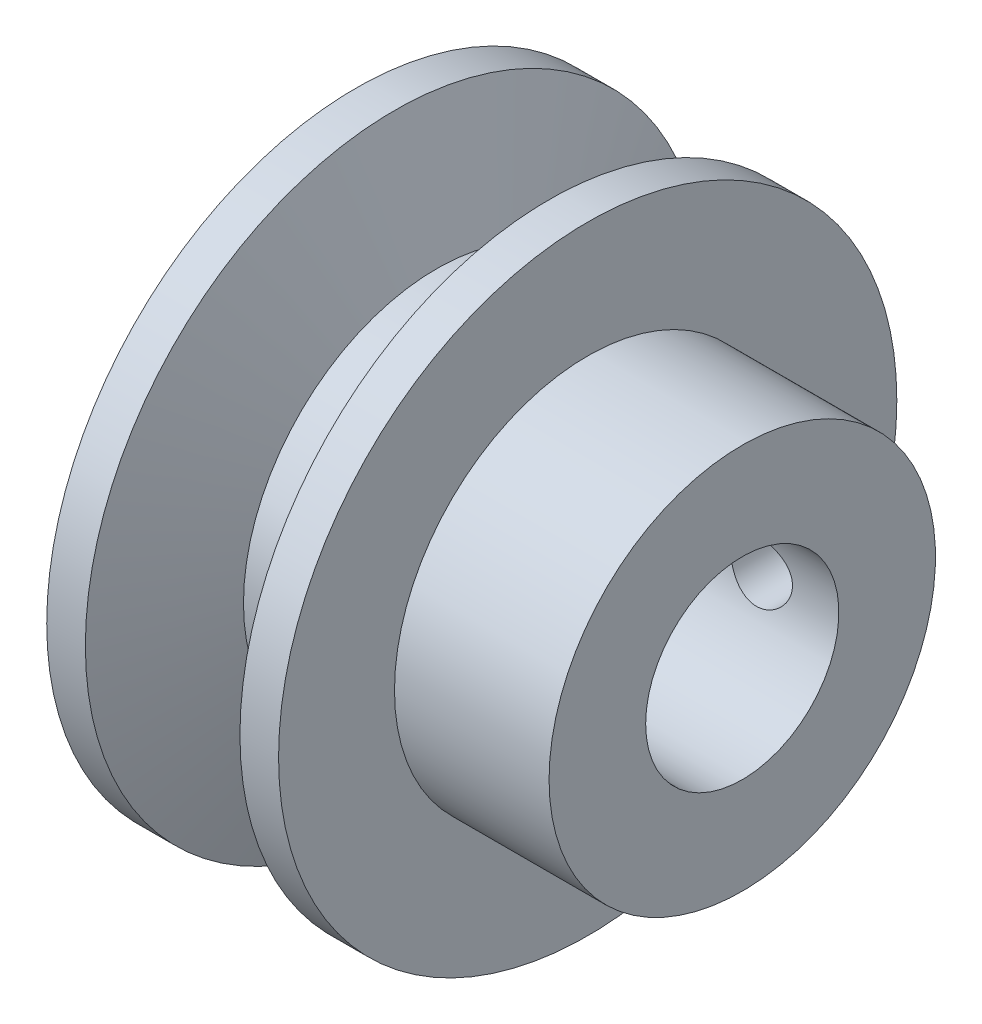
ISO-10303-21;
HEADER;
FILE_DESCRIPTION(('STEP AP214'),'2;1');
FILE_NAME('part.step','',(''),(''),'','','');
FILE_SCHEMA(('AUTOMOTIVE_DESIGN { 1 0 10303 214 1 1 1 1 }'));
ENDSEC;
DATA;
#1=APPLICATION_CONTEXT('core data for automotive mechanical design processes');
#2=APPLICATION_PROTOCOL_DEFINITION('international standard','automotive_design',2000,#1);
#3=PRODUCT_CONTEXT('',#1,'mechanical');
#4=PRODUCT('Part','Part','',(#3));
#5=PRODUCT_RELATED_PRODUCT_CATEGORY('part','',(#4));
#6=PRODUCT_DEFINITION_FORMATION('','',#4);
#7=PRODUCT_DEFINITION_CONTEXT('part definition',#1,'design');
#8=PRODUCT_DEFINITION('design','',#6,#7);
#9=PRODUCT_DEFINITION_SHAPE('','',#8);
#10=(LENGTH_UNIT() NAMED_UNIT(*) SI_UNIT(.MILLI.,.METRE.));
#11=(NAMED_UNIT(*) PLANE_ANGLE_UNIT() SI_UNIT($,.RADIAN.));
#12=(NAMED_UNIT(*) SI_UNIT($,.STERADIAN.) SOLID_ANGLE_UNIT());
#13=UNCERTAINTY_MEASURE_WITH_UNIT(LENGTH_MEASURE(1.E-05),#10,'distance_accuracy_value','');
#14=(GEOMETRIC_REPRESENTATION_CONTEXT(3) GLOBAL_UNCERTAINTY_ASSIGNED_CONTEXT((#13)) GLOBAL_UNIT_ASSIGNED_CONTEXT((#10,
#11,#12)) REPRESENTATION_CONTEXT('',''));
#15=CARTESIAN_POINT('',(0.,0.,0.));
#16=DIRECTION('',(0.,0.,1.));
#17=DIRECTION('',(1.,0.,0.));
#18=AXIS2_PLACEMENT_3D('',#15,#16,#17);
#19=CARTESIAN_POINT('',(50.,0.,0.));
#20=DIRECTION('',(1.,0.,0.));
#21=DIRECTION('',(0.,0.,-1.));
#22=AXIS2_PLACEMENT_3D('',#19,#20,#21);
#23=PLANE('',#22);
#24=CARTESIAN_POINT('',(50.,0.,0.));
#25=DIRECTION('',(-1.,0.,0.));
#26=DIRECTION('',(0.,0.,1.));
#27=AXIS2_PLACEMENT_3D('',#24,#25,#26);
#28=CIRCLE('',#27,12.5);
#29=CARTESIAN_POINT('',(50.,0.,12.5));
#30=VERTEX_POINT('',#29);
#31=EDGE_CURVE('E62',#30,#30,#28,.T.);
#32=ORIENTED_EDGE('',*,*,#31,.T.);
#33=EDGE_LOOP('',(#32));
#34=FACE_BOUND('',#33,.T.);
#35=CARTESIAN_POINT('',(50.,0.,0.));
#36=DIRECTION('',(-1.,0.,0.));
#37=DIRECTION('',(0.,0.,1.));
#38=AXIS2_PLACEMENT_3D('',#35,#36,#37);
#39=CIRCLE('',#38,25.);
#40=CARTESIAN_POINT('',(50.,0.,25.));
#41=VERTEX_POINT('',#40);
#42=EDGE_CURVE('E66',#41,#41,#39,.T.);
#43=ORIENTED_EDGE('',*,*,#42,.F.);
#44=EDGE_LOOP('',(#43));
#45=FACE_BOUND('',#44,.T.);
#46=ADVANCED_FACE('F55',(#34,#45),#23,.T.);
#47=CARTESIAN_POINT('',(40.,0.,-25.));
#48=DIRECTION('',(0.,0.,-1.));
#49=DIRECTION('',(-1.,0.,0.));
#50=AXIS2_PLACEMENT_3D('',#47,#48,#49);
#51=CYLINDRICAL_SURFACE('',#50,4.);
#52=CARTESIAN_POINT('',(36.,0.,-12.5));
#53=CARTESIAN_POINT('',(36.0000006091265,-0.218739515789949,-12.4999994635907));
#54=CARTESIAN_POINT('',(36.0180014881981,-0.437486592647651,-12.4942046039089));
#55=CARTESIAN_POINT('',(36.0893295488232,-0.868567253093706,-12.4716565543057));
#56=CARTESIAN_POINT('',(36.1426631795448,-1.08089965843427,-12.454901363839));
#57=CARTESIAN_POINT('',(36.2826623030294,-1.49287306447891,-12.4122595908852));
#58=CARTESIAN_POINT('',(36.3692747309265,-1.69253368346148,-12.3863875511298));
#59=CARTESIAN_POINT('',(36.5731420752182,-2.07449690712789,-12.3281725410718));
#60=CARTESIAN_POINT('',(36.690402264414,-2.25679651756236,-12.2958284575098));
#61=CARTESIAN_POINT('',(36.9562102837601,-2.60473689448744,-12.2269266983455));
#62=CARTESIAN_POINT('',(37.1055677473836,-2.76974023061599,-12.1902739433225));
#63=CARTESIAN_POINT('',(37.4296076663685,-3.07283559233071,-12.1174266425772));
#64=CARTESIAN_POINT('',(37.6042951191371,-3.21092229484498,-12.0812321888099));
#65=CARTESIAN_POINT('',(37.9796321362761,-3.45978487684573,-12.012370269974));
#66=CARTESIAN_POINT('',(38.1808407031768,-3.56975307774838,-11.9798196408788));
#67=CARTESIAN_POINT('',(38.6001058594249,-3.75402292836496,-11.9233664449728));
#68=CARTESIAN_POINT('',(38.8181577449692,-3.82833449433394,-11.8994614742253));
#69=CARTESIAN_POINT('',(39.2577065181837,-3.93682835778228,-11.8640030689908));
#70=CARTESIAN_POINT('',(39.4788802543856,-3.97219742115686,-11.8520853732299));
#71=CARTESIAN_POINT('',(39.9243189979557,-4.00551082647404,-11.8408707762137));
#72=CARTESIAN_POINT('',(40.1485831196096,-4.00346567735333,-11.8415703310132));
#73=CARTESIAN_POINT('',(40.5839139622491,-3.96293451839878,-11.8551904771854));
#74=CARTESIAN_POINT('',(40.795141133701,-3.92597105327877,-11.8676004346024));
#75=CARTESIAN_POINT('',(41.2082221111399,-3.81912647431514,-11.9024114349979));
#76=CARTESIAN_POINT('',(41.4100748739827,-3.74924170672462,-11.9248135869381));
#77=CARTESIAN_POINT('',(41.802244647037,-3.57749112898224,-11.9774663544073));
#78=CARTESIAN_POINT('',(41.9923405498713,-3.47515682759626,-12.0078307368189));
#79=CARTESIAN_POINT('',(42.3531551075743,-3.24173735834848,-12.0729361214443));
#80=CARTESIAN_POINT('',(42.5238685068609,-3.11064442067799,-12.1076783053403));
#81=CARTESIAN_POINT('',(42.8496616821636,-2.81601378851059,-12.1796593035711));
#82=CARTESIAN_POINT('',(43.0036019423465,-2.6512234062353,-12.216938020211));
#83=CARTESIAN_POINT('',(43.2819466955847,-2.29770358054263,-12.2883292028654));
#84=CARTESIAN_POINT('',(43.4063487828574,-2.10897218913167,-12.3224414108409));
#85=CARTESIAN_POINT('',(43.6229086082004,-1.710653951781,-12.3840447436164));
#86=CARTESIAN_POINT('',(43.714782752091,-1.50090319860161,-12.411477013699));
#87=CARTESIAN_POINT('',(43.8615989916568,-1.06783962590281,-12.4562040275044));
#88=CARTESIAN_POINT('',(43.9165528695418,-0.844531157828867,-12.4735020051158));
#89=CARTESIAN_POINT('',(43.986000166663,-0.400354473973302,-12.4954856059785));
#90=CARTESIAN_POINT('',(44.0020351840278,-0.179750715042688,-12.5006515044539));
#91=CARTESIAN_POINT('',(43.9975519544467,0.261025673970263,-12.4992163829611));
#92=CARTESIAN_POINT('',(43.9770393367253,0.481198365218597,-12.4926171751051));
#93=CARTESIAN_POINT('',(43.9012747172971,0.908837545509528,-12.4687095079374));
#94=CARTESIAN_POINT('',(43.8469502247852,1.11648590619506,-12.4516871662316));
#95=CARTESIAN_POINT('',(43.7062455015094,1.51965413650146,-12.4089396498837));
#96=CARTESIAN_POINT('',(43.6198612584946,1.71517248448531,-12.3832133859887));
#97=CARTESIAN_POINT('',(43.4150724570546,2.09399230967611,-12.3248882754976));
#98=CARTESIAN_POINT('',(43.2959187201442,2.27686405125241,-12.2921331567523));
#99=CARTESIAN_POINT('',(43.0298653175359,2.62052875751655,-12.223485206012));
#100=CARTESIAN_POINT('',(42.8829577838542,2.78131543888496,-12.187591485802));
#101=CARTESIAN_POINT('',(42.5583146009726,3.08320803721588,-12.1148241820809));
#102=CARTESIAN_POINT('',(42.3795493307788,3.2232144868905,-12.0779721041684));
#103=CARTESIAN_POINT('',(42.0002633138545,3.47135354981423,-12.0090110777536));
#104=CARTESIAN_POINT('',(41.7997427463649,3.57948642564104,-11.9769020901785));
#105=CARTESIAN_POINT('',(41.3828910533598,3.76018950753078,-11.9214065721644));
#106=CARTESIAN_POINT('',(41.1666146625258,3.83287665768614,-11.8979914205013));
#107=CARTESIAN_POINT('',(40.7239819754742,3.94051670615503,-11.8627820424832));
#108=CARTESIAN_POINT('',(40.49762979716,3.97548487516417,-11.8509831134183));
#109=CARTESIAN_POINT('',(40.05281007709,4.00556338278915,-11.8408481974692));
#110=CARTESIAN_POINT('',(39.8344774716775,4.00248471115015,-11.8419004772846));
#111=CARTESIAN_POINT('',(39.4016074864132,3.96095887873425,-11.8558539773436));
#112=CARTESIAN_POINT('',(39.1870699135974,3.92251352152802,-11.8687545933658));
#113=CARTESIAN_POINT('',(38.7712914365578,3.81258331041153,-11.9045135786104));
#114=CARTESIAN_POINT('',(38.5698920027678,3.74164069856766,-11.9272081809191));
#115=CARTESIAN_POINT('',(38.181695598998,3.56916068710955,-11.979949389859));
#116=CARTESIAN_POINT('',(37.9949017105932,3.46761685286564,-12.009997542498));
#117=CARTESIAN_POINT('',(37.632975925464,3.2319816676858,-12.0755873592094));
#118=CARTESIAN_POINT('',(37.4586293431649,3.09673271078946,-12.111302976317));
#119=CARTESIAN_POINT('',(37.1345206354476,2.79953499482212,-12.1834295211838));
#120=CARTESIAN_POINT('',(36.9847652370034,2.63757895417058,-12.2198406361674));
#121=CARTESIAN_POINT('',(36.7088542851904,2.28478052574589,-12.2907777050029));
#122=CARTESIAN_POINT('',(36.5837026202892,2.09312837940196,-12.3251937970096));
#123=CARTESIAN_POINT('',(36.3675495297569,1.69040882481735,-12.3868446924465));
#124=CARTESIAN_POINT('',(36.276536301698,1.4793481580204,-12.4140819767823));
#125=CARTESIAN_POINT('',(36.1368805504239,1.05915857911211,-12.4567085266016));
#126=CARTESIAN_POINT('',(36.0857038735422,0.850941916218327,-12.4727975325363));
#127=CARTESIAN_POINT('',(36.01726714274,0.428485002690299,-12.4944423385348));
#128=CARTESIAN_POINT('',(35.9999994033863,0.214246128153487,-12.5000005253903));
#129=CARTESIAN_POINT('',(36.,0.,-12.5));
#130=B_SPLINE_CURVE_WITH_KNOTS('',3,(#52,#53,#54,#55,#56,#57,#58,#59,#60,#61,#62,#63,#64,#65,
#66,#67,#68,#69,#70,#71,#72,#73,#74,#75,#76,#77,#78,#79,#80,#81,#82,#83,#84,#85,#86,#87,#88,#89,
#90,#91,#92,#93,#94,#95,#96,#97,#98,#99,#100,#101,#102,#103,#104,#105,#106,#107,#108,#109,#110,
#111,#112,#113,#114,#115,#116,#117,#118,#119,#120,#121,#122,#123,#124,#125,#126,#127,#128,#129),
.UNSPECIFIED.,.T.,.F.,(4,2,2,2,2,2,2,2,2,2,2,2,2,2,2,2,2,2,2,2,2,2,2,2,2,2,2,2,2,2,2,2,2,2,2,2,
2,2,4),(0.,0.655430724666217,1.31098111587091,1.96549050527927,2.62011257411757,
3.29374295378917,3.96750641671064,4.65887072066566,5.35004264179886,6.01951224998766,
6.68879381985558,7.33017723381302,7.97163184802041,8.62280489842004,9.27415409537618,
9.95668212026653,10.6392657156648,11.3276617834058,12.0158380617097,12.6762752648346,
13.3366107533684,13.9795854097457,14.6226405610093,15.281833876428,15.9412143491714,
16.6280748263774,17.3149296449995,17.9995027669286,18.6837986322708,19.3356533743721,
19.9874748761256,20.6287955720838,21.2702512150686,21.937843916949,22.6056189371905,
23.2966571383324,23.9874562112942,24.6295685076846,25.2715352530413),.UNSPECIFIED.);
#131=CARTESIAN_POINT('',(36.,0.,-12.5));
#132=VERTEX_POINT('',#131);
#133=EDGE_CURVE('E96',#132,#132,#130,.T.);
#134=ORIENTED_EDGE('',*,*,#133,.T.);
#135=EDGE_LOOP('',(#134));
#136=FACE_BOUND('',#135,.T.);
#137=CARTESIAN_POINT('',(44.,0.,-25.));
#138=CARTESIAN_POINT('',(43.9999993699836,0.11151725459432,-24.9999997550203));
#139=CARTESIAN_POINT('',(43.9953322293648,0.223050814303785,-24.9992518303276));
#140=CARTESIAN_POINT('',(43.9766955731456,0.445359780639853,-24.9962802429163));
#141=CARTESIAN_POINT('',(43.9627217141043,0.55613480886156,-24.9940558911516));
#142=CARTESIAN_POINT('',(43.9255398943716,0.776279842626285,-24.9881876680656));
#143=CARTESIAN_POINT('',(43.9023170691677,0.885647292455339,-24.9845415118837));
#144=CARTESIAN_POINT('',(43.8468231712934,1.10202107791946,-24.975934611509));
#145=CARTESIAN_POINT('',(43.8145486683073,1.20902650180103,-24.9709733689767));
#146=CARTESIAN_POINT('',(43.7045804675347,1.52501032252093,-24.9543298929867));
#147=CARTESIAN_POINT('',(43.6136550469055,1.72946770862317,-24.9408733366944));
#148=CARTESIAN_POINT('',(43.399286307076,2.12003271494625,-24.910719881338));
#149=CARTESIAN_POINT('',(43.275855353493,2.30614727614598,-24.894024215117));
#150=CARTESIAN_POINT('',(42.9987546875774,2.65664140331742,-24.8590734844916));
#151=CARTESIAN_POINT('',(42.8448505932301,2.82083485309682,-24.8408069964396));
#152=CARTESIAN_POINT('',(42.5116796706622,3.12118362008291,-24.8048616618847));
#153=CARTESIAN_POINT('',(42.3324100024415,3.25733579351315,-24.7871828814572));
#154=CARTESIAN_POINT('',(41.9523515598787,3.49846318488527,-24.7543066117487));
#155=CARTESIAN_POINT('',(41.7514474191694,3.60325873524733,-24.7391236382185));
#156=CARTESIAN_POINT('',(41.3346067515467,3.77754539820772,-24.713113221201));
#157=CARTESIAN_POINT('',(41.1186712901907,3.84703901043855,-24.7022854693439));
#158=CARTESIAN_POINT('',(40.6798394434142,3.94817508813217,-24.686322902375));
#159=CARTESIAN_POINT('',(40.4570177600207,3.98013403574232,-24.6811405144121));
#160=CARTESIAN_POINT('',(40.0091183946412,4.00627423619823,-24.6769113419527));
#161=CARTESIAN_POINT('',(39.7840408569872,4.00045789073542,-24.6778641673893));
#162=CARTESIAN_POINT('',(39.3402708751486,3.95147108570599,-24.6857542780142));
#163=CARTESIAN_POINT('',(39.1215381305491,3.90865522229075,-24.6926347518736));
#164=CARTESIAN_POINT('',(38.6943995336652,3.78743935312285,-24.7115161704094));
#165=CARTESIAN_POINT('',(38.4859940962846,3.70903791898919,-24.7235173206253));
#166=CARTESIAN_POINT('',(38.084353858252,3.51851269628484,-24.751350156679));
#167=CARTESIAN_POINT('',(37.891191226106,3.40623936388775,-24.767198767097));
#168=CARTESIAN_POINT('',(37.5263251205786,3.15126348149077,-24.8009276499781));
#169=CARTESIAN_POINT('',(37.3546215755056,3.00856103315438,-24.8188079156534));
#170=CARTESIAN_POINT('',(37.0355213715094,2.69490376517042,-24.854831893305));
#171=CARTESIAN_POINT('',(36.8884190408464,2.52364992782859,-24.8729763102821));
#172=CARTESIAN_POINT('',(36.624889488915,2.15853265191804,-24.9073126217894));
#173=CARTESIAN_POINT('',(36.5084760458209,1.96465911409899,-24.9235036375517));
#174=CARTESIAN_POINT('',(36.3594694313742,1.6611251714002,-24.9449607805563));
#175=CARTESIAN_POINT('',(36.3140267189083,1.55768235357734,-24.951648512437));
#176=CARTESIAN_POINT('',(36.232034352782,1.3472779681061,-24.9638922094));
#177=CARTESIAN_POINT('',(36.195481271848,1.24031777464545,-24.9694486105161));
#178=CARTESIAN_POINT('',(36.1316014215699,1.0238244505048,-24.9792616836015));
#179=CARTESIAN_POINT('',(36.1042592570173,0.914295943655119,-24.9835205231762));
#180=CARTESIAN_POINT('',(36.0589315734,0.693317830764865,-24.9906285737655));
#181=CARTESIAN_POINT('',(36.0409415487838,0.581869176574785,-24.9934784635328));
#182=CARTESIAN_POINT('',(36.0184721433002,0.391918401250993,-24.9970495475788));
#183=CARTESIAN_POINT('',(36.0115478287319,0.313703750696993,-24.9981545305223));
#184=CARTESIAN_POINT('',(36.0023115336206,0.156995426820081,-24.9996298432316));
#185=CARTESIAN_POINT('',(35.9999995565046,0.0785017532898934,-25.0000001724516));
#186=CARTESIAN_POINT('',(36.0000006300164,-0.111517254594319,-24.9999997550203));
#187=CARTESIAN_POINT('',(36.0046677706352,-0.223050814303784,-24.9992518303276));
#188=CARTESIAN_POINT('',(36.0233044268544,-0.445359780639852,-24.9962802429163));
#189=CARTESIAN_POINT('',(36.0372782858957,-0.556134808861559,-24.9940558911516));
#190=CARTESIAN_POINT('',(36.0744601056284,-0.776279842626285,-24.9881876680656));
#191=CARTESIAN_POINT('',(36.0976829308323,-0.885647292455338,-24.9845415118837));
#192=CARTESIAN_POINT('',(36.1531768287066,-1.10202107791946,-24.975934611509));
#193=CARTESIAN_POINT('',(36.1854513316927,-1.20902650180103,-24.9709733689767));
#194=CARTESIAN_POINT('',(36.2954195324653,-1.52501032252093,-24.9543298929867));
#195=CARTESIAN_POINT('',(36.3863449530945,-1.72946770862317,-24.9408733366944));
#196=CARTESIAN_POINT('',(36.600713692924,-2.12003271494625,-24.910719881338));
#197=CARTESIAN_POINT('',(36.724144646507,-2.30614727614598,-24.894024215117));
#198=CARTESIAN_POINT('',(37.0012453124226,-2.65664140331742,-24.8590734844916));
#199=CARTESIAN_POINT('',(37.1551494067699,-2.82083485309682,-24.8408069964396));
#200=CARTESIAN_POINT('',(37.4883203293378,-3.12118362008291,-24.8048616618847));
#201=CARTESIAN_POINT('',(37.6675899975585,-3.25733579351315,-24.7871828814572));
#202=CARTESIAN_POINT('',(38.0476484401214,-3.49846318488527,-24.7543066117487));
#203=CARTESIAN_POINT('',(38.2485525808306,-3.60325873524734,-24.7391236382185));
#204=CARTESIAN_POINT('',(38.6653932484533,-3.77754539820772,-24.713113221201));
#205=CARTESIAN_POINT('',(38.8813287098093,-3.84703901043855,-24.7022854693439));
#206=CARTESIAN_POINT('',(39.3201605565858,-3.94817508813217,-24.686322902375));
#207=CARTESIAN_POINT('',(39.5429822399793,-3.98013403574232,-24.6811405144121));
#208=CARTESIAN_POINT('',(39.9908816053588,-4.00627423619823,-24.6769113419527));
#209=CARTESIAN_POINT('',(40.2159591430128,-4.00045789073542,-24.6778641673893));
#210=CARTESIAN_POINT('',(40.6597291248514,-3.95147108570599,-24.6857542780142));
#211=CARTESIAN_POINT('',(40.8784618694509,-3.90865522229074,-24.6926347518736));
#212=CARTESIAN_POINT('',(41.3056004663348,-3.78743935312285,-24.7115161704094));
#213=CARTESIAN_POINT('',(41.5140059037154,-3.70903791898919,-24.7235173206253));
#214=CARTESIAN_POINT('',(41.915646141748,-3.51851269628484,-24.751350156679));
#215=CARTESIAN_POINT('',(42.108808773894,-3.40623936388775,-24.767198767097));
#216=CARTESIAN_POINT('',(42.4736748794214,-3.15126348149077,-24.8009276499781));
#217=CARTESIAN_POINT('',(42.6453784244944,-3.00856103315438,-24.8188079156534));
#218=CARTESIAN_POINT('',(42.9644786284906,-2.69490376517042,-24.854831893305));
#219=CARTESIAN_POINT('',(43.1115809591536,-2.52364992782859,-24.8729763102821));
#220=CARTESIAN_POINT('',(43.375110511085,-2.15853265191804,-24.9073126217894));
#221=CARTESIAN_POINT('',(43.4915239541791,-1.96465911409899,-24.9235036375517));
#222=CARTESIAN_POINT('',(43.6405305686258,-1.6611251714002,-24.9449607805563));
#223=CARTESIAN_POINT('',(43.6859732810917,-1.55768235357734,-24.951648512437));
#224=CARTESIAN_POINT('',(43.767965647218,-1.3472779681061,-24.9638922094));
#225=CARTESIAN_POINT('',(43.804518728152,-1.24031777464544,-24.9694486105161));
#226=CARTESIAN_POINT('',(43.8683985784301,-1.0238244505048,-24.9792616836015));
#227=CARTESIAN_POINT('',(43.8957407429827,-0.914295943655118,-24.9835205231762));
#228=CARTESIAN_POINT('',(43.9410684266,-0.693317830764865,-24.9906285737655));
#229=CARTESIAN_POINT('',(43.9590584512162,-0.581869176574785,-24.9934784635328));
#230=CARTESIAN_POINT('',(43.9815278566998,-0.391918401250994,-24.9970495475788));
#231=CARTESIAN_POINT('',(43.9884521712681,-0.313703750696994,-24.9981545305223));
#232=CARTESIAN_POINT('',(43.9976884663794,-0.156995426820081,-24.9996298432316));
#233=CARTESIAN_POINT('',(44.0000004434954,-0.0785017532898938,-25.0000001724516));
#234=CARTESIAN_POINT('',(44.,0.,-25.));
#235=B_SPLINE_CURVE_WITH_KNOTS('',3,(#137,#138,#139,#140,#141,#142,#143,#144,#145,#146,#147,
#148,#149,#150,#151,#152,#153,#154,#155,#156,#157,#158,#159,#160,#161,#162,#163,#164,#165,#166,
#167,#168,#169,#170,#171,#172,#173,#174,#175,#176,#177,#178,#179,#180,#181,#182,#183,#184,#185,
#186,#187,#188,#189,#190,#191,#192,#193,#194,#195,#196,#197,#198,#199,#200,#201,#202,#203,#204,
#205,#206,#207,#208,#209,#210,#211,#212,#213,#214,#215,#216,#217,#218,#219,#220,#221,#222,#223,
#224,#225,#226,#227,#228,#229,#230,#231,#232,#233,#234),.UNSPECIFIED.,.T.,.F.,(4,2,2,2,2,2,2,2,
2,2,2,2,2,2,2,2,2,2,2,2,2,2,2,2,2,2,2,2,2,2,2,2,2,2,2,2,2,2,2,2,2,2,2,2,2,2,2,2,4),(0.,
0.334479260084594,0.66911473096908,1.0042901969669,1.33959285650475,2.00866082488834,
2.6774746360124,3.35164774962302,4.02589640534446,4.70393748847212,5.38193055469347,
6.05416496349351,6.72635663314627,7.39217670746758,8.05802350972541,8.72685413699699,
9.3956825297447,10.0720149279805,10.7486504592732,11.0878602493619,11.4269390537847,
11.765448273888,12.103794259962,12.3392483064394,12.5747025278625,12.909181787947,
13.2438172588315,13.5789927248294,13.9142953843672,14.5833633527508,15.2521771638749,
15.9263502774855,16.6005989332069,17.2786400163346,17.9566330825559,18.628867491356,
19.3010591610087,19.96687923533,20.6327260375879,21.3015566648594,21.9703850576072,
22.6467174558429,23.3233529871357,23.6625627772244,24.0016415816472,24.3401508017504,
24.6784967878244,24.9139508343018,25.1494050557249),.UNSPECIFIED.);
#236=CARTESIAN_POINT('',(44.,0.,-25.));
#237=VERTEX_POINT('',#236);
#238=EDGE_CURVE('E104',#237,#237,#235,.T.);
#239=ORIENTED_EDGE('',*,*,#238,.F.);
#240=EDGE_LOOP('',(#239));
#241=FACE_BOUND('',#240,.T.);
#242=ADVANCED_FACE('F113',(#136,#241),#51,.F.);
#243=CARTESIAN_POINT('',(5.,0.,0.));
#244=DIRECTION('',(-1.,0.,0.));
#245=DIRECTION('',(0.,0.,1.));
#246=AXIS2_PLACEMENT_3D('',#243,#244,#245);
#247=CONICAL_SURFACE('',#246,12.5,0.982793723247329);
#248=CARTESIAN_POINT('',(0.,0.,0.));
#249=DIRECTION('',(-1.,0.,0.));
#250=DIRECTION('',(0.,0.,1.));
#251=AXIS2_PLACEMENT_3D('',#248,#249,#250);
#252=CIRCLE('',#251,20.);
#253=CARTESIAN_POINT('',(0.,0.,20.));
#254=VERTEX_POINT('',#253);
#255=EDGE_CURVE('E93',#254,#254,#252,.T.);
#256=ORIENTED_EDGE('',*,*,#255,.T.);
#257=EDGE_LOOP('',(#256));
#258=FACE_BOUND('',#257,.T.);
#259=CARTESIAN_POINT('',(5.,0.,0.));
#260=DIRECTION('',(-1.,0.,0.));
#261=DIRECTION('',(0.,0.,1.));
#262=AXIS2_PLACEMENT_3D('',#259,#260,#261);
#263=CIRCLE('',#262,12.5);
#264=CARTESIAN_POINT('',(5.,0.,12.5));
#265=VERTEX_POINT('',#264);
#266=EDGE_CURVE('E11',#265,#265,#263,.T.);
#267=ORIENTED_EDGE('',*,*,#266,.F.);
#268=EDGE_LOOP('',(#267));
#269=FACE_BOUND('',#268,.T.);
#270=ADVANCED_FACE('F57',(#258,#269),#247,.F.);
#271=CARTESIAN_POINT('',(-23.2214843556114,0.,0.));
#272=DIRECTION('',(-1.,0.,0.));
#273=DIRECTION('',(0.,0.,1.));
#274=AXIS2_PLACEMENT_3D('',#271,#272,#273);
#275=CYLINDRICAL_SURFACE('',#274,12.5);
#276=ORIENTED_EDGE('',*,*,#133,.F.);
#277=EDGE_LOOP('',(#276));
#278=FACE_BOUND('',#277,.T.);
#279=ORIENTED_EDGE('',*,*,#31,.F.);
#280=EDGE_LOOP('',(#279));
#281=FACE_BOUND('',#280,.T.);
#282=ORIENTED_EDGE('',*,*,#266,.T.);
#283=EDGE_LOOP('',(#282));
#284=FACE_BOUND('',#283,.T.);
#285=ADVANCED_FACE('F149',(#278,#281,#284),#275,.F.);
#286=CARTESIAN_POINT('',(-23.2214843556114,0.,0.));
#287=DIRECTION('',(-1.,0.,0.));
#288=DIRECTION('',(0.,0.,1.));
#289=AXIS2_PLACEMENT_3D('',#286,#287,#288);
#290=CYLINDRICAL_SURFACE('',#289,25.);
#291=ORIENTED_EDGE('',*,*,#42,.T.);
#292=EDGE_LOOP('',(#291));
#293=FACE_BOUND('',#292,.T.);
#294=CARTESIAN_POINT('',(30.,0.,0.));
#295=DIRECTION('',(-1.,0.,0.));
#296=DIRECTION('',(0.,0.,1.));
#297=AXIS2_PLACEMENT_3D('',#294,#295,#296);
#298=CIRCLE('',#297,25.);
#299=CARTESIAN_POINT('',(30.,0.,25.));
#300=VERTEX_POINT('',#299);
#301=EDGE_CURVE('E70',#300,#300,#298,.T.);
#302=ORIENTED_EDGE('',*,*,#301,.F.);
#303=EDGE_LOOP('',(#302));
#304=FACE_BOUND('',#303,.T.);
#305=ORIENTED_EDGE('',*,*,#238,.T.);
#306=EDGE_LOOP('',(#305));
#307=FACE_BOUND('',#306,.T.);
#308=ADVANCED_FACE('F145',(#293,#304,#307),#290,.T.);
#309=CARTESIAN_POINT('',(30.,0.,0.));
#310=DIRECTION('',(1.,0.,0.));
#311=DIRECTION('',(0.,0.,-1.));
#312=AXIS2_PLACEMENT_3D('',#309,#310,#311);
#313=PLANE('',#312);
#314=ORIENTED_EDGE('',*,*,#301,.T.);
#315=EDGE_LOOP('',(#314));
#316=FACE_BOUND('',#315,.T.);
#317=CARTESIAN_POINT('',(30.,0.,0.));
#318=DIRECTION('',(-1.,0.,0.));
#319=DIRECTION('',(0.,0.,1.));
#320=AXIS2_PLACEMENT_3D('',#317,#318,#319);
#321=CIRCLE('',#320,40.);
#322=CARTESIAN_POINT('',(30.,0.,40.));
#323=VERTEX_POINT('',#322);
#324=EDGE_CURVE('E75',#323,#323,#321,.T.);
#325=ORIENTED_EDGE('',*,*,#324,.F.);
#326=EDGE_LOOP('',(#325));
#327=FACE_BOUND('',#326,.T.);
#328=ADVANCED_FACE('F141',(#316,#327),#313,.T.);
#329=CARTESIAN_POINT('',(-23.2214843556114,0.,0.));
#330=DIRECTION('',(-1.,0.,0.));
#331=DIRECTION('',(0.,0.,1.));
#332=AXIS2_PLACEMENT_3D('',#329,#330,#331);
#333=CYLINDRICAL_SURFACE('',#332,40.);
#334=ORIENTED_EDGE('',*,*,#324,.T.);
#335=EDGE_LOOP('',(#334));
#336=FACE_BOUND('',#335,.T.);
#337=CARTESIAN_POINT('',(25.,0.,0.));
#338=DIRECTION('',(-1.,0.,0.));
#339=DIRECTION('',(0.,0.,1.));
#340=AXIS2_PLACEMENT_3D('',#337,#338,#339);
#341=CIRCLE('',#340,40.);
#342=CARTESIAN_POINT('',(25.,0.,40.));
#343=VERTEX_POINT('',#342);
#344=EDGE_CURVE('E78',#343,#343,#341,.T.);
#345=ORIENTED_EDGE('',*,*,#344,.F.);
#346=EDGE_LOOP('',(#345));
#347=FACE_BOUND('',#346,.T.);
#348=ADVANCED_FACE('F137',(#336,#347),#333,.T.);
#349=CARTESIAN_POINT('',(25.,0.,0.));
#350=DIRECTION('',(1.,0.,0.));
#351=DIRECTION('',(0.,0.,-1.));
#352=AXIS2_PLACEMENT_3D('',#349,#350,#351);
#353=CONICAL_SURFACE('',#352,40.,1.22173047639603);
#354=CARTESIAN_POINT('',(19.540446486007,0.,0.));
#355=DIRECTION('',(-1.,0.,0.));
#356=DIRECTION('',(0.,0.,1.));
#357=AXIS2_PLACEMENT_3D('',#354,#355,#356);
#358=CIRCLE('',#357,25.);
#359=CARTESIAN_POINT('',(19.540446486007,0.,25.));
#360=VERTEX_POINT('',#359);
#361=EDGE_CURVE('E81',#360,#360,#358,.T.);
#362=ORIENTED_EDGE('',*,*,#361,.F.);
#363=EDGE_LOOP('',(#362));
#364=FACE_BOUND('',#363,.T.);
#365=ORIENTED_EDGE('',*,*,#344,.T.);
#366=EDGE_LOOP('',(#365));
#367=FACE_BOUND('',#366,.T.);
#368=ADVANCED_FACE('F133',(#364,#367),#353,.T.);
#369=CARTESIAN_POINT('',(-23.2214843556114,0.,0.));
#370=DIRECTION('',(-1.,0.,0.));
#371=DIRECTION('',(0.,0.,1.));
#372=AXIS2_PLACEMENT_3D('',#369,#370,#371);
#373=CYLINDRICAL_SURFACE('',#372,25.);
#374=ORIENTED_EDGE('',*,*,#361,.T.);
#375=EDGE_LOOP('',(#374));
#376=FACE_BOUND('',#375,.T.);
#377=CARTESIAN_POINT('',(10.4595535139931,0.,0.));
#378=DIRECTION('',(-1.,0.,0.));
#379=DIRECTION('',(0.,0.,1.));
#380=AXIS2_PLACEMENT_3D('',#377,#378,#379);
#381=CIRCLE('',#380,25.);
#382=CARTESIAN_POINT('',(10.4595535139931,0.,25.));
#383=VERTEX_POINT('',#382);
#384=EDGE_CURVE('E84',#383,#383,#381,.T.);
#385=ORIENTED_EDGE('',*,*,#384,.F.);
#386=EDGE_LOOP('',(#385));
#387=FACE_BOUND('',#386,.T.);
#388=ADVANCED_FACE('F129',(#376,#387),#373,.T.);
#389=CARTESIAN_POINT('',(5.,0.,0.));
#390=DIRECTION('',(-1.,0.,0.));
#391=DIRECTION('',(0.,0.,1.));
#392=AXIS2_PLACEMENT_3D('',#389,#390,#391);
#393=CONICAL_SURFACE('',#392,40.,1.22173047639603);
#394=ORIENTED_EDGE('',*,*,#384,.T.);
#395=EDGE_LOOP('',(#394));
#396=FACE_BOUND('',#395,.T.);
#397=CARTESIAN_POINT('',(5.,0.,0.));
#398=DIRECTION('',(-1.,0.,0.));
#399=DIRECTION('',(0.,0.,1.));
#400=AXIS2_PLACEMENT_3D('',#397,#398,#399);
#401=CIRCLE('',#400,40.);
#402=CARTESIAN_POINT('',(5.,0.,40.));
#403=VERTEX_POINT('',#402);
#404=EDGE_CURVE('E87',#403,#403,#401,.T.);
#405=ORIENTED_EDGE('',*,*,#404,.F.);
#406=EDGE_LOOP('',(#405));
#407=FACE_BOUND('',#406,.T.);
#408=ADVANCED_FACE('F125',(#396,#407),#393,.T.);
#409=CARTESIAN_POINT('',(-23.2214843556114,0.,0.));
#410=DIRECTION('',(-1.,0.,0.));
#411=DIRECTION('',(0.,0.,1.));
#412=AXIS2_PLACEMENT_3D('',#409,#410,#411);
#413=CYLINDRICAL_SURFACE('',#412,40.);
#414=ORIENTED_EDGE('',*,*,#404,.T.);
#415=EDGE_LOOP('',(#414));
#416=FACE_BOUND('',#415,.T.);
#417=CARTESIAN_POINT('',(0.,0.,0.));
#418=DIRECTION('',(-1.,0.,0.));
#419=DIRECTION('',(0.,0.,1.));
#420=AXIS2_PLACEMENT_3D('',#417,#418,#419);
#421=CIRCLE('',#420,40.);
#422=CARTESIAN_POINT('',(0.,0.,40.));
#423=VERTEX_POINT('',#422);
#424=EDGE_CURVE('E90',#423,#423,#421,.T.);
#425=ORIENTED_EDGE('',*,*,#424,.F.);
#426=EDGE_LOOP('',(#425));
#427=FACE_BOUND('',#426,.T.);
#428=ADVANCED_FACE('F121',(#416,#427),#413,.T.);
#429=CARTESIAN_POINT('',(0.,0.,0.));
#430=DIRECTION('',(1.,0.,0.));
#431=DIRECTION('',(0.,0.,-1.));
#432=AXIS2_PLACEMENT_3D('',#429,#430,#431);
#433=PLANE('',#432);
#434=ORIENTED_EDGE('',*,*,#255,.F.);
#435=EDGE_LOOP('',(#434));
#436=FACE_BOUND('',#435,.T.);
#437=ORIENTED_EDGE('',*,*,#424,.T.);
#438=EDGE_LOOP('',(#437));
#439=FACE_BOUND('',#438,.T.);
#440=ADVANCED_FACE('F118',(#436,#439),#433,.F.);
#441=CLOSED_SHELL('',(#46,#242,#270,#285,#308,#328,#348,#368,#388,#408,#428,#440));
#442=MANIFOLD_SOLID_BREP('B2',#441);
#443=ADVANCED_BREP_SHAPE_REPRESENTATION('',(#18,#442),#14);
#444=SHAPE_DEFINITION_REPRESENTATION(#9,#443);
ENDSEC;
END-ISO-10303-21;
